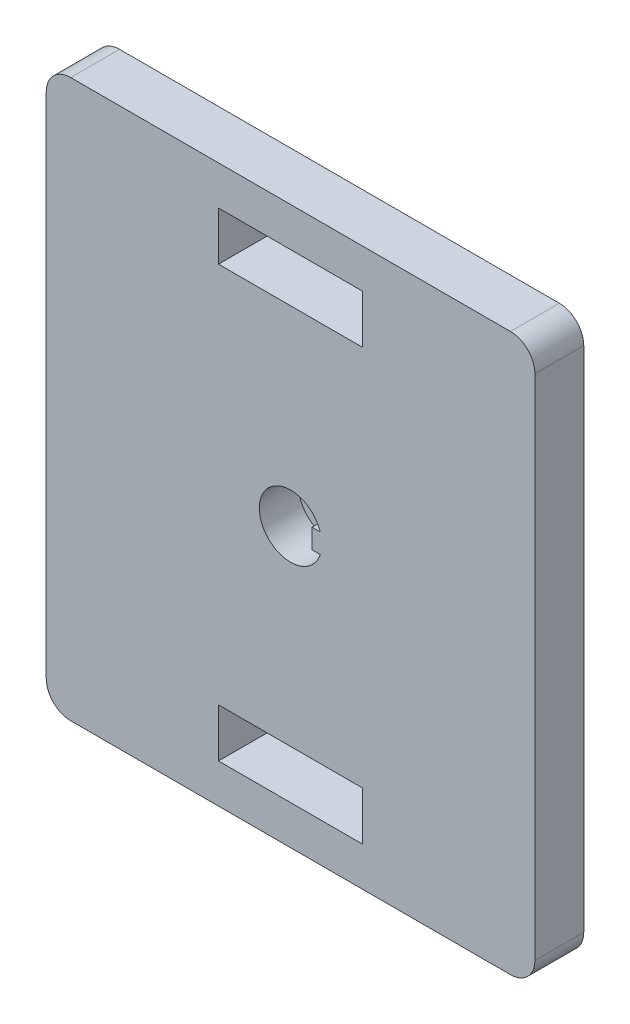
ISO-10303-21;
HEADER;
FILE_DESCRIPTION(('STEP AP214'),'2;1');
FILE_NAME('part.step','',(''),(''),'','','');
FILE_SCHEMA(('AUTOMOTIVE_DESIGN { 1 0 10303 214 1 1 1 1 }'));
ENDSEC;
DATA;
#1=APPLICATION_CONTEXT('core data for automotive mechanical design processes');
#2=APPLICATION_PROTOCOL_DEFINITION('international standard','automotive_design',2000,#1);
#3=PRODUCT_CONTEXT('',#1,'mechanical');
#4=PRODUCT('Part','Part','',(#3));
#5=PRODUCT_RELATED_PRODUCT_CATEGORY('part','',(#4));
#6=PRODUCT_DEFINITION_FORMATION('','',#4);
#7=PRODUCT_DEFINITION_CONTEXT('part definition',#1,'design');
#8=PRODUCT_DEFINITION('design','',#6,#7);
#9=PRODUCT_DEFINITION_SHAPE('','',#8);
#10=(LENGTH_UNIT() NAMED_UNIT(*) SI_UNIT(.MILLI.,.METRE.));
#11=(NAMED_UNIT(*) PLANE_ANGLE_UNIT() SI_UNIT($,.RADIAN.));
#12=(NAMED_UNIT(*) SI_UNIT($,.STERADIAN.) SOLID_ANGLE_UNIT());
#13=UNCERTAINTY_MEASURE_WITH_UNIT(LENGTH_MEASURE(1.E-05),#10,'distance_accuracy_value','');
#14=(GEOMETRIC_REPRESENTATION_CONTEXT(3) GLOBAL_UNCERTAINTY_ASSIGNED_CONTEXT((#13)) GLOBAL_UNIT_ASSIGNED_CONTEXT((#10,
#11,#12)) REPRESENTATION_CONTEXT('',''));
#15=CARTESIAN_POINT('',(0.,0.,0.));
#16=DIRECTION('',(0.,0.,1.));
#17=DIRECTION('',(1.,0.,0.));
#18=AXIS2_PLACEMENT_3D('',#15,#16,#17);
#19=CARTESIAN_POINT('',(0.,114.,0.));
#20=DIRECTION('',(-1.,0.,0.));
#21=DIRECTION('',(0.,-1.,0.));
#22=AXIS2_PLACEMENT_3D('',#19,#20,#21);
#23=PLANE('',#22);
#24=DIRECTION('',(0.,-1.,0.));
#25=VECTOR('',#24,1.);
#26=CARTESIAN_POINT('',(0.,114.,0.));
#27=LINE('',#26,#25);
#28=CARTESIAN_POINT('',(0.,109.,0.));
#29=VERTEX_POINT('',#28);
#30=CARTESIAN_POINT('',(0.,5.,0.));
#31=VERTEX_POINT('',#30);
#32=EDGE_CURVE('E316',#29,#31,#27,.T.);
#33=ORIENTED_EDGE('',*,*,#32,.T.);
#34=DIRECTION('',(0.,0.,1.));
#35=VECTOR('',#34,1.);
#36=CARTESIAN_POINT('',(0.,5.,0.));
#37=LINE('',#36,#35);
#38=CARTESIAN_POINT('',(0.,5.,10.));
#39=VERTEX_POINT('',#38);
#40=EDGE_CURVE('E349',#31,#39,#37,.T.);
#41=ORIENTED_EDGE('',*,*,#40,.T.);
#42=DIRECTION('',(0.,-1.,0.));
#43=VECTOR('',#42,1.);
#44=CARTESIAN_POINT('',(0.,114.,10.));
#45=LINE('',#44,#43);
#46=CARTESIAN_POINT('',(0.,109.,10.));
#47=VERTEX_POINT('',#46);
#48=EDGE_CURVE('E306',#47,#39,#45,.T.);
#49=ORIENTED_EDGE('',*,*,#48,.F.);
#50=DIRECTION('',(0.,0.,1.));
#51=VECTOR('',#50,1.);
#52=CARTESIAN_POINT('',(0.,109.,0.));
#53=LINE('',#52,#51);
#54=EDGE_CURVE('E332',#47,#29,#53,.F.);
#55=ORIENTED_EDGE('',*,*,#54,.T.);
#56=EDGE_LOOP('',(#33,#41,#49,#55));
#57=FACE_BOUND('',#56,.T.);
#58=ADVANCED_FACE('F39',(#57),#23,.T.);
#59=CARTESIAN_POINT('',(100.,114.,0.));
#60=DIRECTION('',(0.,1.,0.));
#61=DIRECTION('',(-1.,0.,0.));
#62=AXIS2_PLACEMENT_3D('',#59,#60,#61);
#63=PLANE('',#62);
#64=DIRECTION('',(-1.,0.,0.));
#65=VECTOR('',#64,1.);
#66=CARTESIAN_POINT('',(100.,114.,0.));
#67=LINE('',#66,#65);
#68=CARTESIAN_POINT('',(95.,114.,0.));
#69=VERTEX_POINT('',#68);
#70=CARTESIAN_POINT('',(4.99999999999999,114.,0.));
#71=VERTEX_POINT('',#70);
#72=EDGE_CURVE('E328',#69,#71,#67,.T.);
#73=ORIENTED_EDGE('',*,*,#72,.T.);
#74=DIRECTION('',(0.,0.,1.));
#75=VECTOR('',#74,1.);
#76=CARTESIAN_POINT('',(4.99999999999999,114.,0.));
#77=LINE('',#76,#75);
#78=CARTESIAN_POINT('',(4.99999999999999,114.,10.));
#79=VERTEX_POINT('',#78);
#80=EDGE_CURVE('E386',#71,#79,#77,.T.);
#81=ORIENTED_EDGE('',*,*,#80,.T.);
#82=DIRECTION('',(-1.,0.,0.));
#83=VECTOR('',#82,1.);
#84=CARTESIAN_POINT('',(100.,114.,10.));
#85=LINE('',#84,#83);
#86=CARTESIAN_POINT('',(95.,114.,10.));
#87=VERTEX_POINT('',#86);
#88=EDGE_CURVE('E321',#87,#79,#85,.T.);
#89=ORIENTED_EDGE('',*,*,#88,.F.);
#90=DIRECTION('',(0.,0.,1.));
#91=VECTOR('',#90,1.);
#92=CARTESIAN_POINT('',(95.,114.,0.));
#93=LINE('',#92,#91);
#94=EDGE_CURVE('E383',#87,#69,#93,.F.);
#95=ORIENTED_EDGE('',*,*,#94,.T.);
#96=EDGE_LOOP('',(#73,#81,#89,#95));
#97=FACE_BOUND('',#96,.T.);
#98=ADVANCED_FACE('F423',(#97),#63,.T.);
#99=CARTESIAN_POINT('',(100.,0.,0.));
#100=DIRECTION('',(1.,0.,0.));
#101=DIRECTION('',(0.,0.,-1.));
#102=AXIS2_PLACEMENT_3D('',#99,#100,#101);
#103=PLANE('',#102);
#104=DIRECTION('',(0.,1.,0.));
#105=VECTOR('',#104,1.);
#106=CARTESIAN_POINT('',(100.,0.,10.));
#107=LINE('',#106,#105);
#108=CARTESIAN_POINT('',(100.,5.,10.));
#109=VERTEX_POINT('',#108);
#110=CARTESIAN_POINT('',(100.,109.,10.));
#111=VERTEX_POINT('',#110);
#112=EDGE_CURVE('E340',#109,#111,#107,.T.);
#113=ORIENTED_EDGE('',*,*,#112,.F.);
#114=DIRECTION('',(0.,0.,1.));
#115=VECTOR('',#114,1.);
#116=CARTESIAN_POINT('',(100.,5.,0.));
#117=LINE('',#116,#115);
#118=CARTESIAN_POINT('',(100.,5.,0.));
#119=VERTEX_POINT('',#118);
#120=EDGE_CURVE('E11',#109,#119,#117,.F.);
#121=ORIENTED_EDGE('',*,*,#120,.T.);
#122=DIRECTION('',(0.,1.,0.));
#123=VECTOR('',#122,1.);
#124=CARTESIAN_POINT('',(100.,0.,0.));
#125=LINE('',#124,#123);
#126=CARTESIAN_POINT('',(100.,109.,0.));
#127=VERTEX_POINT('',#126);
#128=EDGE_CURVE('E325',#119,#127,#125,.T.);
#129=ORIENTED_EDGE('',*,*,#128,.T.);
#130=DIRECTION('',(0.,0.,1.));
#131=VECTOR('',#130,1.);
#132=CARTESIAN_POINT('',(100.,109.,0.));
#133=LINE('',#132,#131);
#134=EDGE_CURVE('E48',#127,#111,#133,.T.);
#135=ORIENTED_EDGE('',*,*,#134,.T.);
#136=EDGE_LOOP('',(#113,#121,#129,#135));
#137=FACE_BOUND('',#136,.T.);
#138=ADVANCED_FACE('F394',(#137),#103,.T.);
#139=CARTESIAN_POINT('',(0.,0.,0.));
#140=DIRECTION('',(0.,-1.,0.));
#141=DIRECTION('',(0.,0.,-1.));
#142=AXIS2_PLACEMENT_3D('',#139,#140,#141);
#143=PLANE('',#142);
#144=DIRECTION('',(1.,0.,0.));
#145=VECTOR('',#144,1.);
#146=CARTESIAN_POINT('',(0.,0.,10.));
#147=LINE('',#146,#145);
#148=CARTESIAN_POINT('',(5.,0.,10.));
#149=VERTEX_POINT('',#148);
#150=CARTESIAN_POINT('',(95.,0.,10.));
#151=VERTEX_POINT('',#150);
#152=EDGE_CURVE('E336',#149,#151,#147,.T.);
#153=ORIENTED_EDGE('',*,*,#152,.F.);
#154=DIRECTION('',(0.,0.,1.));
#155=VECTOR('',#154,1.);
#156=CARTESIAN_POINT('',(5.,0.,0.));
#157=LINE('',#156,#155);
#158=CARTESIAN_POINT('',(5.,0.,0.));
#159=VERTEX_POINT('',#158);
#160=EDGE_CURVE('E369',#149,#159,#157,.F.);
#161=ORIENTED_EDGE('',*,*,#160,.T.);
#162=DIRECTION('',(1.,0.,0.));
#163=VECTOR('',#162,1.);
#164=CARTESIAN_POINT('',(0.,0.,0.));
#165=LINE('',#164,#163);
#166=CARTESIAN_POINT('',(95.,0.,0.));
#167=VERTEX_POINT('',#166);
#168=EDGE_CURVE('E320',#159,#167,#165,.T.);
#169=ORIENTED_EDGE('',*,*,#168,.T.);
#170=DIRECTION('',(0.,0.,1.));
#171=VECTOR('',#170,1.);
#172=CARTESIAN_POINT('',(95.,0.,0.));
#173=LINE('',#172,#171);
#174=EDGE_CURVE('E365',#167,#151,#173,.T.);
#175=ORIENTED_EDGE('',*,*,#174,.T.);
#176=EDGE_LOOP('',(#153,#161,#169,#175));
#177=FACE_BOUND('',#176,.T.);
#178=ADVANCED_FACE('F406',(#177),#143,.T.);
#179=CARTESIAN_POINT('',(0.,0.,0.));
#180=DIRECTION('',(0.,0.,1.));
#181=DIRECTION('',(1.,0.,0.));
#182=AXIS2_PLACEMENT_3D('',#179,#180,#181);
#183=PLANE('',#182);
#184=DIRECTION('',(0.,1.,0.));
#185=VECTOR('',#184,1.);
#186=CARTESIAN_POINT('',(35.25,8.,0.));
#187=LINE('',#186,#185);
#188=CARTESIAN_POINT('',(35.25,8.,0.));
#189=VERTEX_POINT('',#188);
#190=CARTESIAN_POINT('',(35.25,17.95,0.));
#191=VERTEX_POINT('',#190);
#192=EDGE_CURVE('E248',#189,#191,#187,.T.);
#193=ORIENTED_EDGE('',*,*,#192,.F.);
#194=DIRECTION('',(-1.,0.,0.));
#195=VECTOR('',#194,1.);
#196=CARTESIAN_POINT('',(64.75,8.,0.));
#197=LINE('',#196,#195);
#198=CARTESIAN_POINT('',(64.75,8.,0.));
#199=VERTEX_POINT('',#198);
#200=EDGE_CURVE('E222',#199,#189,#197,.T.);
#201=ORIENTED_EDGE('',*,*,#200,.F.);
#202=DIRECTION('',(0.,-1.,0.));
#203=VECTOR('',#202,1.);
#204=CARTESIAN_POINT('',(64.75,17.95,0.));
#205=LINE('',#204,#203);
#206=CARTESIAN_POINT('',(64.75,17.95,0.));
#207=VERTEX_POINT('',#206);
#208=EDGE_CURVE('E233',#207,#199,#205,.T.);
#209=ORIENTED_EDGE('',*,*,#208,.F.);
#210=DIRECTION('',(1.,0.,0.));
#211=VECTOR('',#210,1.);
#212=CARTESIAN_POINT('',(35.25,17.95,0.));
#213=LINE('',#212,#211);
#214=EDGE_CURVE('E252',#191,#207,#213,.T.);
#215=ORIENTED_EDGE('',*,*,#214,.F.);
#216=EDGE_LOOP('',(#193,#201,#209,#215));
#217=FACE_BOUND('',#216,.T.);
#218=DIRECTION('',(-1.,0.,0.));
#219=VECTOR('',#218,1.);
#220=CARTESIAN_POINT('',(64.75,106.,0.));
#221=LINE('',#220,#219);
#222=CARTESIAN_POINT('',(64.75,106.,0.));
#223=VERTEX_POINT('',#222);
#224=CARTESIAN_POINT('',(35.25,106.,0.));
#225=VERTEX_POINT('',#224);
#226=EDGE_CURVE('E285',#223,#225,#221,.T.);
#227=ORIENTED_EDGE('',*,*,#226,.T.);
#228=DIRECTION('',(0.,-1.,0.));
#229=VECTOR('',#228,1.);
#230=CARTESIAN_POINT('',(35.25,106.,0.));
#231=LINE('',#230,#229);
#232=CARTESIAN_POINT('',(35.25,96.05,0.));
#233=VERTEX_POINT('',#232);
#234=EDGE_CURVE('E272',#225,#233,#231,.T.);
#235=ORIENTED_EDGE('',*,*,#234,.T.);
#236=DIRECTION('',(1.,0.,0.));
#237=VECTOR('',#236,1.);
#238=CARTESIAN_POINT('',(35.25,96.05,0.));
#239=LINE('',#238,#237);
#240=CARTESIAN_POINT('',(64.75,96.05,0.));
#241=VERTEX_POINT('',#240);
#242=EDGE_CURVE('E276',#233,#241,#239,.T.);
#243=ORIENTED_EDGE('',*,*,#242,.T.);
#244=DIRECTION('',(0.,1.,0.));
#245=VECTOR('',#244,1.);
#246=CARTESIAN_POINT('',(64.75,96.05,0.));
#247=LINE('',#246,#245);
#248=EDGE_CURVE('E281',#241,#223,#247,.T.);
#249=ORIENTED_EDGE('',*,*,#248,.T.);
#250=EDGE_LOOP('',(#227,#235,#243,#249));
#251=FACE_BOUND('',#250,.T.);
#252=ORIENTED_EDGE('',*,*,#168,.F.);
#253=CARTESIAN_POINT('',(5.,5.,0.));
#254=DIRECTION('',(0.,0.,1.));
#255=DIRECTION('',(1.,0.,0.));
#256=AXIS2_PLACEMENT_3D('',#253,#254,#255);
#257=CIRCLE('',#256,5.);
#258=EDGE_CURVE('E380',#159,#31,#257,.F.);
#259=ORIENTED_EDGE('',*,*,#258,.T.);
#260=ORIENTED_EDGE('',*,*,#32,.F.);
#261=CARTESIAN_POINT('',(4.99999999999999,109.,0.));
#262=DIRECTION('',(0.,0.,1.));
#263=DIRECTION('',(1.,0.,0.));
#264=AXIS2_PLACEMENT_3D('',#261,#262,#263);
#265=CIRCLE('',#264,5.);
#266=EDGE_CURVE('E377',#29,#71,#265,.F.);
#267=ORIENTED_EDGE('',*,*,#266,.T.);
#268=ORIENTED_EDGE('',*,*,#72,.F.);
#269=CARTESIAN_POINT('',(95.,109.,0.));
#270=DIRECTION('',(0.,0.,1.));
#271=DIRECTION('',(1.,0.,0.));
#272=AXIS2_PLACEMENT_3D('',#269,#270,#271);
#273=CIRCLE('',#272,5.);
#274=EDGE_CURVE('E63',#69,#127,#273,.F.);
#275=ORIENTED_EDGE('',*,*,#274,.T.);
#276=ORIENTED_EDGE('',*,*,#128,.F.);
#277=CARTESIAN_POINT('',(95.,5.,0.));
#278=DIRECTION('',(0.,0.,1.));
#279=DIRECTION('',(1.,0.,0.));
#280=AXIS2_PLACEMENT_3D('',#277,#278,#279);
#281=CIRCLE('',#280,5.);
#282=EDGE_CURVE('E374',#119,#167,#281,.F.);
#283=ORIENTED_EDGE('',*,*,#282,.T.);
#284=EDGE_LOOP('',(#252,#259,#260,#267,#268,#275,#276,#283));
#285=FACE_BOUND('',#284,.T.);
#286=ADVANCED_FACE('F410',(#217,#251,#285),#183,.F.);
#287=CARTESIAN_POINT('',(0.,0.,10.));
#288=DIRECTION('',(0.,0.,1.));
#289=DIRECTION('',(1.,0.,0.));
#290=AXIS2_PLACEMENT_3D('',#287,#288,#289);
#291=PLANE('',#290);
#292=DIRECTION('',(1.,0.,0.));
#293=VECTOR('',#292,1.);
#294=CARTESIAN_POINT('',(54.4,59.,10.));
#295=LINE('',#294,#293);
#296=CARTESIAN_POINT('',(54.4,59.,10.));
#297=VERTEX_POINT('',#296);
#298=CARTESIAN_POINT('',(56.0794736614283,59.,10.));
#299=VERTEX_POINT('',#298);
#300=EDGE_CURVE('E55',#297,#299,#295,.T.);
#301=ORIENTED_EDGE('',*,*,#300,.F.);
#302=DIRECTION('',(0.,-1.,0.));
#303=VECTOR('',#302,1.);
#304=CARTESIAN_POINT('',(54.4,59.,10.));
#305=LINE('',#304,#303);
#306=CARTESIAN_POINT('',(54.4,55.,10.));
#307=VERTEX_POINT('',#306);
#308=EDGE_CURVE('E200',#297,#307,#305,.T.);
#309=ORIENTED_EDGE('',*,*,#308,.T.);
#310=DIRECTION('',(1.,0.,0.));
#311=VECTOR('',#310,1.);
#312=CARTESIAN_POINT('',(54.4,55.,10.));
#313=LINE('',#312,#311);
#314=CARTESIAN_POINT('',(56.0794736614283,55.,10.));
#315=VERTEX_POINT('',#314);
#316=EDGE_CURVE('E204',#307,#315,#313,.T.);
#317=ORIENTED_EDGE('',*,*,#316,.T.);
#318=CARTESIAN_POINT('',(50.,57.,10.));
#319=DIRECTION('',(0.,0.,1.));
#320=DIRECTION('',(1.,0.,0.));
#321=AXIS2_PLACEMENT_3D('',#318,#319,#320);
#322=CIRCLE('',#321,6.40000000000001);
#323=EDGE_CURVE('E213',#299,#315,#322,.T.);
#324=ORIENTED_EDGE('',*,*,#323,.F.);
#325=EDGE_LOOP('',(#301,#309,#317,#324));
#326=FACE_BOUND('',#325,.T.);
#327=DIRECTION('',(-1.,0.,0.));
#328=VECTOR('',#327,1.);
#329=CARTESIAN_POINT('',(64.75,8.,10.));
#330=LINE('',#329,#328);
#331=CARTESIAN_POINT('',(64.75,8.,10.));
#332=VERTEX_POINT('',#331);
#333=CARTESIAN_POINT('',(35.25,8.,10.));
#334=VERTEX_POINT('',#333);
#335=EDGE_CURVE('E228',#332,#334,#330,.T.);
#336=ORIENTED_EDGE('',*,*,#335,.T.);
#337=DIRECTION('',(0.,1.,0.));
#338=VECTOR('',#337,1.);
#339=CARTESIAN_POINT('',(35.25,8.,10.));
#340=LINE('',#339,#338);
#341=CARTESIAN_POINT('',(35.25,17.95,10.));
#342=VERTEX_POINT('',#341);
#343=EDGE_CURVE('E232',#334,#342,#340,.T.);
#344=ORIENTED_EDGE('',*,*,#343,.T.);
#345=DIRECTION('',(1.,0.,0.));
#346=VECTOR('',#345,1.);
#347=CARTESIAN_POINT('',(35.25,17.95,10.));
#348=LINE('',#347,#346);
#349=CARTESIAN_POINT('',(64.75,17.95,10.));
#350=VERTEX_POINT('',#349);
#351=EDGE_CURVE('E237',#342,#350,#348,.T.);
#352=ORIENTED_EDGE('',*,*,#351,.T.);
#353=DIRECTION('',(0.,-1.,0.));
#354=VECTOR('',#353,1.);
#355=CARTESIAN_POINT('',(64.75,17.95,10.));
#356=LINE('',#355,#354);
#357=EDGE_CURVE('E241',#350,#332,#356,.T.);
#358=ORIENTED_EDGE('',*,*,#357,.T.);
#359=EDGE_LOOP('',(#336,#344,#352,#358));
#360=FACE_BOUND('',#359,.T.);
#361=DIRECTION('',(0.,-1.,0.));
#362=VECTOR('',#361,1.);
#363=CARTESIAN_POINT('',(35.25,106.,10.));
#364=LINE('',#363,#362);
#365=CARTESIAN_POINT('',(35.25,106.,10.));
#366=VERTEX_POINT('',#365);
#367=CARTESIAN_POINT('',(35.25,96.05,10.));
#368=VERTEX_POINT('',#367);
#369=EDGE_CURVE('E262',#366,#368,#364,.T.);
#370=ORIENTED_EDGE('',*,*,#369,.F.);
#371=DIRECTION('',(-1.,0.,0.));
#372=VECTOR('',#371,1.);
#373=CARTESIAN_POINT('',(64.75,106.,10.));
#374=LINE('',#373,#372);
#375=CARTESIAN_POINT('',(64.75,106.,10.));
#376=VERTEX_POINT('',#375);
#377=EDGE_CURVE('E277',#376,#366,#374,.T.);
#378=ORIENTED_EDGE('',*,*,#377,.F.);
#379=DIRECTION('',(0.,1.,0.));
#380=VECTOR('',#379,1.);
#381=CARTESIAN_POINT('',(64.75,96.05,10.));
#382=LINE('',#381,#380);
#383=CARTESIAN_POINT('',(64.75,96.05,10.));
#384=VERTEX_POINT('',#383);
#385=EDGE_CURVE('E296',#384,#376,#382,.T.);
#386=ORIENTED_EDGE('',*,*,#385,.F.);
#387=DIRECTION('',(1.,0.,0.));
#388=VECTOR('',#387,1.);
#389=CARTESIAN_POINT('',(35.25,96.05,10.));
#390=LINE('',#389,#388);
#391=EDGE_CURVE('E292',#368,#384,#390,.T.);
#392=ORIENTED_EDGE('',*,*,#391,.F.);
#393=EDGE_LOOP('',(#370,#378,#386,#392));
#394=FACE_BOUND('',#393,.T.);
#395=ORIENTED_EDGE('',*,*,#48,.T.);
#396=CARTESIAN_POINT('',(5.,5.,10.));
#397=DIRECTION('',(0.,0.,1.));
#398=DIRECTION('',(1.,0.,0.));
#399=AXIS2_PLACEMENT_3D('',#396,#397,#398);
#400=CIRCLE('',#399,5.);
#401=EDGE_CURVE('E362',#39,#149,#400,.T.);
#402=ORIENTED_EDGE('',*,*,#401,.T.);
#403=ORIENTED_EDGE('',*,*,#152,.T.);
#404=CARTESIAN_POINT('',(95.,5.,10.));
#405=DIRECTION('',(0.,0.,1.));
#406=DIRECTION('',(1.,0.,0.));
#407=AXIS2_PLACEMENT_3D('',#404,#405,#406);
#408=CIRCLE('',#407,5.);
#409=EDGE_CURVE('E356',#151,#109,#408,.T.);
#410=ORIENTED_EDGE('',*,*,#409,.T.);
#411=ORIENTED_EDGE('',*,*,#112,.T.);
#412=CARTESIAN_POINT('',(95.,109.,10.));
#413=DIRECTION('',(0.,0.,1.));
#414=DIRECTION('',(1.,0.,0.));
#415=AXIS2_PLACEMENT_3D('',#412,#413,#414);
#416=CIRCLE('',#415,5.);
#417=EDGE_CURVE('E353',#111,#87,#416,.T.);
#418=ORIENTED_EDGE('',*,*,#417,.T.);
#419=ORIENTED_EDGE('',*,*,#88,.T.);
#420=CARTESIAN_POINT('',(4.99999999999999,109.,10.));
#421=DIRECTION('',(0.,0.,1.));
#422=DIRECTION('',(1.,0.,0.));
#423=AXIS2_PLACEMENT_3D('',#420,#421,#422);
#424=CIRCLE('',#423,5.);
#425=EDGE_CURVE('E359',#79,#47,#424,.T.);
#426=ORIENTED_EDGE('',*,*,#425,.T.);
#427=EDGE_LOOP('',(#395,#402,#403,#410,#411,#418,#419,#426));
#428=FACE_BOUND('',#427,.T.);
#429=ADVANCED_FACE('F398',(#326,#360,#394,#428),#291,.T.);
#430=CARTESIAN_POINT('',(35.25,106.,0.));
#431=DIRECTION('',(-1.,0.,0.));
#432=DIRECTION('',(0.,0.,1.));
#433=AXIS2_PLACEMENT_3D('',#430,#431,#432);
#434=PLANE('',#433);
#435=ORIENTED_EDGE('',*,*,#369,.T.);
#436=DIRECTION('',(0.,0.,1.));
#437=VECTOR('',#436,1.);
#438=CARTESIAN_POINT('',(35.25,96.05,0.));
#439=LINE('',#438,#437);
#440=EDGE_CURVE('E289',#233,#368,#439,.T.);
#441=ORIENTED_EDGE('',*,*,#440,.F.);
#442=ORIENTED_EDGE('',*,*,#234,.F.);
#443=DIRECTION('',(0.,0.,1.));
#444=VECTOR('',#443,1.);
#445=CARTESIAN_POINT('',(35.25,106.,0.));
#446=LINE('',#445,#444);
#447=EDGE_CURVE('E303',#225,#366,#446,.T.);
#448=ORIENTED_EDGE('',*,*,#447,.T.);
#449=EDGE_LOOP('',(#435,#441,#442,#448));
#450=FACE_BOUND('',#449,.T.);
#451=ADVANCED_FACE('F468',(#450),#434,.F.);
#452=CARTESIAN_POINT('',(64.75,106.,0.));
#453=DIRECTION('',(0.,1.,0.));
#454=DIRECTION('',(0.,0.,1.));
#455=AXIS2_PLACEMENT_3D('',#452,#453,#454);
#456=PLANE('',#455);
#457=ORIENTED_EDGE('',*,*,#377,.T.);
#458=ORIENTED_EDGE('',*,*,#447,.F.);
#459=ORIENTED_EDGE('',*,*,#226,.F.);
#460=DIRECTION('',(0.,0.,1.));
#461=VECTOR('',#460,1.);
#462=CARTESIAN_POINT('',(64.75,106.,0.));
#463=LINE('',#462,#461);
#464=EDGE_CURVE('E307',#223,#376,#463,.T.);
#465=ORIENTED_EDGE('',*,*,#464,.T.);
#466=EDGE_LOOP('',(#457,#458,#459,#465));
#467=FACE_BOUND('',#466,.T.);
#468=ADVANCED_FACE('F533',(#467),#456,.F.);
#469=CARTESIAN_POINT('',(64.75,96.05,0.));
#470=DIRECTION('',(1.,0.,0.));
#471=DIRECTION('',(0.,0.,-1.));
#472=AXIS2_PLACEMENT_3D('',#469,#470,#471);
#473=PLANE('',#472);
#474=ORIENTED_EDGE('',*,*,#385,.T.);
#475=ORIENTED_EDGE('',*,*,#464,.F.);
#476=ORIENTED_EDGE('',*,*,#248,.F.);
#477=DIRECTION('',(0.,0.,1.));
#478=VECTOR('',#477,1.);
#479=CARTESIAN_POINT('',(64.75,96.05,0.));
#480=LINE('',#479,#478);
#481=EDGE_CURVE('E310',#241,#384,#480,.T.);
#482=ORIENTED_EDGE('',*,*,#481,.T.);
#483=EDGE_LOOP('',(#474,#475,#476,#482));
#484=FACE_BOUND('',#483,.T.);
#485=ADVANCED_FACE('F536',(#484),#473,.F.);
#486=CARTESIAN_POINT('',(35.25,96.05,0.));
#487=DIRECTION('',(0.,-1.,0.));
#488=DIRECTION('',(0.,0.,-1.));
#489=AXIS2_PLACEMENT_3D('',#486,#487,#488);
#490=PLANE('',#489);
#491=ORIENTED_EDGE('',*,*,#391,.T.);
#492=ORIENTED_EDGE('',*,*,#481,.F.);
#493=ORIENTED_EDGE('',*,*,#242,.F.);
#494=ORIENTED_EDGE('',*,*,#440,.T.);
#495=EDGE_LOOP('',(#491,#492,#493,#494));
#496=FACE_BOUND('',#495,.T.);
#497=ADVANCED_FACE('F531',(#496),#490,.F.);
#498=CARTESIAN_POINT('',(64.75,8.,10.));
#499=DIRECTION('',(0.,-1.,0.));
#500=DIRECTION('',(0.,0.,-1.));
#501=AXIS2_PLACEMENT_3D('',#498,#499,#500);
#502=PLANE('',#501);
#503=ORIENTED_EDGE('',*,*,#200,.T.);
#504=DIRECTION('',(0.,0.,-1.));
#505=VECTOR('',#504,1.);
#506=CARTESIAN_POINT('',(35.25,8.,10.));
#507=LINE('',#506,#505);
#508=EDGE_CURVE('E245',#334,#189,#507,.T.);
#509=ORIENTED_EDGE('',*,*,#508,.F.);
#510=ORIENTED_EDGE('',*,*,#335,.F.);
#511=DIRECTION('',(0.,0.,-1.));
#512=VECTOR('',#511,1.);
#513=CARTESIAN_POINT('',(64.75,8.,10.));
#514=LINE('',#513,#512);
#515=EDGE_CURVE('E259',#332,#199,#514,.T.);
#516=ORIENTED_EDGE('',*,*,#515,.T.);
#517=EDGE_LOOP('',(#503,#509,#510,#516));
#518=FACE_BOUND('',#517,.T.);
#519=ADVANCED_FACE('F522',(#518),#502,.F.);
#520=CARTESIAN_POINT('',(64.75,17.95,10.));
#521=DIRECTION('',(1.,0.,0.));
#522=DIRECTION('',(0.,0.,-1.));
#523=AXIS2_PLACEMENT_3D('',#520,#521,#522);
#524=PLANE('',#523);
#525=ORIENTED_EDGE('',*,*,#208,.T.);
#526=ORIENTED_EDGE('',*,*,#515,.F.);
#527=ORIENTED_EDGE('',*,*,#357,.F.);
#528=DIRECTION('',(0.,0.,-1.));
#529=VECTOR('',#528,1.);
#530=CARTESIAN_POINT('',(64.75,17.95,10.));
#531=LINE('',#530,#529);
#532=EDGE_CURVE('E263',#350,#207,#531,.T.);
#533=ORIENTED_EDGE('',*,*,#532,.T.);
#534=EDGE_LOOP('',(#525,#526,#527,#533));
#535=FACE_BOUND('',#534,.T.);
#536=ADVANCED_FACE('F518',(#535),#524,.F.);
#537=CARTESIAN_POINT('',(35.25,17.95,10.));
#538=DIRECTION('',(0.,1.,0.));
#539=DIRECTION('',(-1.,0.,0.));
#540=AXIS2_PLACEMENT_3D('',#537,#538,#539);
#541=PLANE('',#540);
#542=ORIENTED_EDGE('',*,*,#214,.T.);
#543=ORIENTED_EDGE('',*,*,#532,.F.);
#544=ORIENTED_EDGE('',*,*,#351,.F.);
#545=DIRECTION('',(0.,0.,-1.));
#546=VECTOR('',#545,1.);
#547=CARTESIAN_POINT('',(35.25,17.95,10.));
#548=LINE('',#547,#546);
#549=EDGE_CURVE('E266',#342,#191,#548,.T.);
#550=ORIENTED_EDGE('',*,*,#549,.T.);
#551=EDGE_LOOP('',(#542,#543,#544,#550));
#552=FACE_BOUND('',#551,.T.);
#553=ADVANCED_FACE('F521',(#552),#541,.F.);
#554=CARTESIAN_POINT('',(35.25,8.,10.));
#555=DIRECTION('',(-1.,0.,0.));
#556=DIRECTION('',(0.,0.,1.));
#557=AXIS2_PLACEMENT_3D('',#554,#555,#556);
#558=PLANE('',#557);
#559=ORIENTED_EDGE('',*,*,#192,.T.);
#560=ORIENTED_EDGE('',*,*,#549,.F.);
#561=ORIENTED_EDGE('',*,*,#343,.F.);
#562=ORIENTED_EDGE('',*,*,#508,.T.);
#563=EDGE_LOOP('',(#559,#560,#561,#562));
#564=FACE_BOUND('',#563,.T.);
#565=ADVANCED_FACE('F443',(#564),#558,.F.);
#566=CARTESIAN_POINT('',(5.,5.,0.));
#567=DIRECTION('',(0.,0.,1.));
#568=DIRECTION('',(1.,0.,0.));
#569=AXIS2_PLACEMENT_3D('',#566,#567,#568);
#570=CYLINDRICAL_SURFACE('',#569,5.);
#571=ORIENTED_EDGE('',*,*,#258,.F.);
#572=ORIENTED_EDGE('',*,*,#160,.F.);
#573=ORIENTED_EDGE('',*,*,#401,.F.);
#574=ORIENTED_EDGE('',*,*,#40,.F.);
#575=EDGE_LOOP('',(#571,#572,#573,#574));
#576=FACE_BOUND('',#575,.T.);
#577=ADVANCED_FACE('F414',(#576),#570,.T.);
#578=CARTESIAN_POINT('',(4.99999999999999,109.,0.));
#579=DIRECTION('',(0.,0.,1.));
#580=DIRECTION('',(1.,0.,0.));
#581=AXIS2_PLACEMENT_3D('',#578,#579,#580);
#582=CYLINDRICAL_SURFACE('',#581,5.);
#583=ORIENTED_EDGE('',*,*,#266,.F.);
#584=ORIENTED_EDGE('',*,*,#54,.F.);
#585=ORIENTED_EDGE('',*,*,#425,.F.);
#586=ORIENTED_EDGE('',*,*,#80,.F.);
#587=EDGE_LOOP('',(#583,#584,#585,#586));
#588=FACE_BOUND('',#587,.T.);
#589=ADVANCED_FACE('F421',(#588),#582,.T.);
#590=CARTESIAN_POINT('',(95.,5.,0.));
#591=DIRECTION('',(0.,0.,1.));
#592=DIRECTION('',(1.,0.,0.));
#593=AXIS2_PLACEMENT_3D('',#590,#591,#592);
#594=CYLINDRICAL_SURFACE('',#593,5.);
#595=ORIENTED_EDGE('',*,*,#282,.F.);
#596=ORIENTED_EDGE('',*,*,#120,.F.);
#597=ORIENTED_EDGE('',*,*,#409,.F.);
#598=ORIENTED_EDGE('',*,*,#174,.F.);
#599=EDGE_LOOP('',(#595,#596,#597,#598));
#600=FACE_BOUND('',#599,.T.);
#601=ADVANCED_FACE('F404',(#600),#594,.T.);
#602=CARTESIAN_POINT('',(95.,109.,0.));
#603=DIRECTION('',(0.,0.,1.));
#604=DIRECTION('',(1.,0.,0.));
#605=AXIS2_PLACEMENT_3D('',#602,#603,#604);
#606=CYLINDRICAL_SURFACE('',#605,5.);
#607=ORIENTED_EDGE('',*,*,#274,.F.);
#608=ORIENTED_EDGE('',*,*,#94,.F.);
#609=ORIENTED_EDGE('',*,*,#417,.F.);
#610=ORIENTED_EDGE('',*,*,#134,.F.);
#611=EDGE_LOOP('',(#607,#608,#609,#610));
#612=FACE_BOUND('',#611,.T.);
#613=ADVANCED_FACE('F41',(#612),#606,.T.);
#614=CARTESIAN_POINT('',(54.4,59.,2.));
#615=DIRECTION('',(0.,-1.,0.));
#616=DIRECTION('',(0.,0.,-1.));
#617=AXIS2_PLACEMENT_3D('',#614,#615,#616);
#618=PLANE('',#617);
#619=ORIENTED_EDGE('',*,*,#300,.T.);
#620=DIRECTION('',(0.,0.,1.));
#621=VECTOR('',#620,1.);
#622=CARTESIAN_POINT('',(56.0794736614283,59.,2.));
#623=LINE('',#622,#621);
#624=CARTESIAN_POINT('',(56.0794736614283,59.,2.));
#625=VERTEX_POINT('',#624);
#626=EDGE_CURVE('E176',#625,#299,#623,.T.);
#627=ORIENTED_EDGE('',*,*,#626,.F.);
#628=DIRECTION('',(1.,0.,0.));
#629=VECTOR('',#628,1.);
#630=CARTESIAN_POINT('',(54.4,59.,2.));
#631=LINE('',#630,#629);
#632=CARTESIAN_POINT('',(54.4,59.,2.));
#633=VERTEX_POINT('',#632);
#634=EDGE_CURVE('E180',#633,#625,#631,.T.);
#635=ORIENTED_EDGE('',*,*,#634,.F.);
#636=DIRECTION('',(0.,0.,1.));
#637=VECTOR('',#636,1.);
#638=CARTESIAN_POINT('',(54.4,59.,2.));
#639=LINE('',#638,#637);
#640=EDGE_CURVE('E219',#633,#297,#639,.T.);
#641=ORIENTED_EDGE('',*,*,#640,.T.);
#642=EDGE_LOOP('',(#619,#627,#635,#641));
#643=FACE_BOUND('',#642,.T.);
#644=ADVANCED_FACE('F178',(#643),#618,.F.);
#645=CARTESIAN_POINT('',(54.4,59.,2.));
#646=DIRECTION('',(-1.,0.,0.));
#647=DIRECTION('',(0.,0.,1.));
#648=AXIS2_PLACEMENT_3D('',#645,#646,#647);
#649=PLANE('',#648);
#650=ORIENTED_EDGE('',*,*,#308,.F.);
#651=ORIENTED_EDGE('',*,*,#640,.F.);
#652=DIRECTION('',(0.,-1.,0.));
#653=VECTOR('',#652,1.);
#654=CARTESIAN_POINT('',(54.4,59.,2.));
#655=LINE('',#654,#653);
#656=CARTESIAN_POINT('',(54.4,55.,2.));
#657=VERTEX_POINT('',#656);
#658=EDGE_CURVE('E186',#633,#657,#655,.T.);
#659=ORIENTED_EDGE('',*,*,#658,.T.);
#660=DIRECTION('',(0.,0.,1.));
#661=VECTOR('',#660,1.);
#662=CARTESIAN_POINT('',(54.4,55.,2.));
#663=LINE('',#662,#661);
#664=EDGE_CURVE('E223',#657,#307,#663,.T.);
#665=ORIENTED_EDGE('',*,*,#664,.T.);
#666=EDGE_LOOP('',(#650,#651,#659,#665));
#667=FACE_BOUND('',#666,.T.);
#668=ADVANCED_FACE('F430',(#667),#649,.T.);
#669=CARTESIAN_POINT('',(54.4,55.,2.));
#670=DIRECTION('',(0.,-1.,0.));
#671=DIRECTION('',(0.,0.,-1.));
#672=AXIS2_PLACEMENT_3D('',#669,#670,#671);
#673=PLANE('',#672);
#674=ORIENTED_EDGE('',*,*,#316,.F.);
#675=ORIENTED_EDGE('',*,*,#664,.F.);
#676=DIRECTION('',(1.,0.,0.));
#677=VECTOR('',#676,1.);
#678=CARTESIAN_POINT('',(54.4,55.,2.));
#679=LINE('',#678,#677);
#680=CARTESIAN_POINT('',(56.0794736614283,55.,2.));
#681=VERTEX_POINT('',#680);
#682=EDGE_CURVE('E195',#657,#681,#679,.T.);
#683=ORIENTED_EDGE('',*,*,#682,.T.);
#684=DIRECTION('',(0.,0.,1.));
#685=VECTOR('',#684,1.);
#686=CARTESIAN_POINT('',(56.0794736614283,55.,2.));
#687=LINE('',#686,#685);
#688=EDGE_CURVE('E185',#681,#315,#687,.T.);
#689=ORIENTED_EDGE('',*,*,#688,.T.);
#690=EDGE_LOOP('',(#674,#675,#683,#689));
#691=FACE_BOUND('',#690,.T.);
#692=ADVANCED_FACE('F487',(#691),#673,.T.);
#693=CARTESIAN_POINT('',(50.,57.,2.));
#694=DIRECTION('',(0.,0.,1.));
#695=DIRECTION('',(1.,0.,0.));
#696=AXIS2_PLACEMENT_3D('',#693,#694,#695);
#697=CYLINDRICAL_SURFACE('',#696,6.40000000000001);
#698=ORIENTED_EDGE('',*,*,#323,.T.);
#699=ORIENTED_EDGE('',*,*,#688,.F.);
#700=CARTESIAN_POINT('',(50.,57.,2.));
#701=DIRECTION('',(0.,0.,1.));
#702=DIRECTION('',(1.,0.,0.));
#703=AXIS2_PLACEMENT_3D('',#700,#701,#702);
#704=CIRCLE('',#703,6.40000000000001);
#705=EDGE_CURVE('E190',#625,#681,#704,.T.);
#706=ORIENTED_EDGE('',*,*,#705,.F.);
#707=ORIENTED_EDGE('',*,*,#626,.T.);
#708=EDGE_LOOP('',(#698,#699,#706,#707));
#709=FACE_BOUND('',#708,.T.);
#710=ADVANCED_FACE('F191',(#709),#697,.F.);
#711=CARTESIAN_POINT('',(50.,57.,2.));
#712=DIRECTION('',(0.,0.,1.));
#713=DIRECTION('',(1.,0.,0.));
#714=AXIS2_PLACEMENT_3D('',#711,#712,#713);
#715=PLANE('',#714);
#716=ORIENTED_EDGE('',*,*,#634,.T.);
#717=ORIENTED_EDGE('',*,*,#705,.T.);
#718=ORIENTED_EDGE('',*,*,#682,.F.);
#719=ORIENTED_EDGE('',*,*,#658,.F.);
#720=EDGE_LOOP('',(#716,#717,#718,#719));
#721=FACE_BOUND('',#720,.T.);
#722=ADVANCED_FACE('F198',(#721),#715,.T.);
#723=CLOSED_SHELL('',(#58,#98,#138,#178,#286,#429,#451,#468,#485,#497,#519,#536,#553,#565,#577,
#589,#601,#613,#644,#668,#692,#710,#722));
#724=MANIFOLD_SOLID_BREP('B2',#723);
#725=ADVANCED_BREP_SHAPE_REPRESENTATION('',(#18,#724),#14);
#726=SHAPE_DEFINITION_REPRESENTATION(#9,#725);
ENDSEC;
END-ISO-10303-21;
